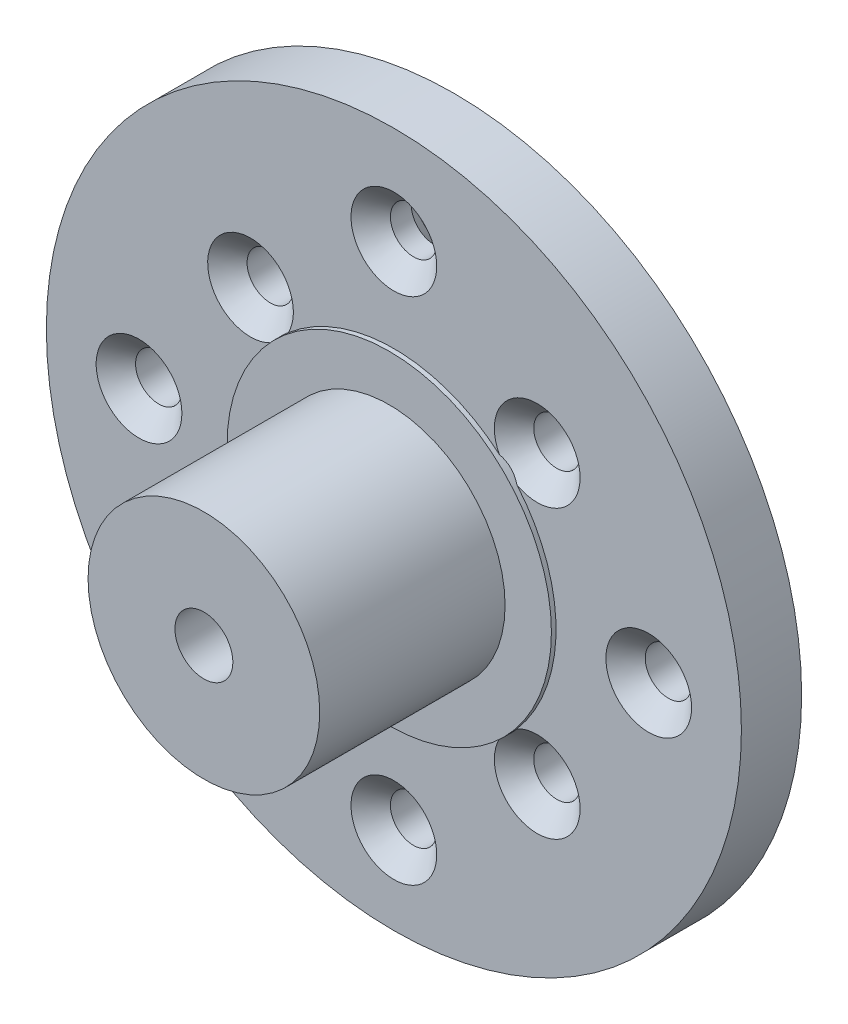
ISO-10303-21;
HEADER;
FILE_DESCRIPTION(('STEP AP214'),'2;1');
FILE_NAME('part.step','',(''),(''),'','','');
FILE_SCHEMA(('AUTOMOTIVE_DESIGN { 1 0 10303 214 1 1 1 1 }'));
ENDSEC;
DATA;
#1=APPLICATION_CONTEXT('core data for automotive mechanical design processes');
#2=APPLICATION_PROTOCOL_DEFINITION('international standard','automotive_design',2000,#1);
#3=PRODUCT_CONTEXT('',#1,'mechanical');
#4=PRODUCT('Part','Part','',(#3));
#5=PRODUCT_RELATED_PRODUCT_CATEGORY('part','',(#4));
#6=PRODUCT_DEFINITION_FORMATION('','',#4);
#7=PRODUCT_DEFINITION_CONTEXT('part definition',#1,'design');
#8=PRODUCT_DEFINITION('design','',#6,#7);
#9=PRODUCT_DEFINITION_SHAPE('','',#8);
#10=(LENGTH_UNIT() NAMED_UNIT(*) SI_UNIT(.MILLI.,.METRE.));
#11=(NAMED_UNIT(*) PLANE_ANGLE_UNIT() SI_UNIT($,.RADIAN.));
#12=(NAMED_UNIT(*) SI_UNIT($,.STERADIAN.) SOLID_ANGLE_UNIT());
#13=UNCERTAINTY_MEASURE_WITH_UNIT(LENGTH_MEASURE(1.E-05),#10,'distance_accuracy_value','');
#14=(GEOMETRIC_REPRESENTATION_CONTEXT(3) GLOBAL_UNCERTAINTY_ASSIGNED_CONTEXT((#13)) GLOBAL_UNIT_ASSIGNED_CONTEXT((#10,
#11,#12)) REPRESENTATION_CONTEXT('',''));
#15=CARTESIAN_POINT('',(0.,0.,0.));
#16=DIRECTION('',(0.,0.,1.));
#17=DIRECTION('',(1.,0.,0.));
#18=AXIS2_PLACEMENT_3D('',#15,#16,#17);
#19=CARTESIAN_POINT('',(6.5746019739521E-13,0.477974548121047,5.2));
#20=DIRECTION('',(0.,0.,1.));
#21=DIRECTION('',(1.,0.,0.));
#22=AXIS2_PLACEMENT_3D('',#19,#20,#21);
#23=PLANE('',#22);
#24=CARTESIAN_POINT('',(0.,22.,5.2));
#25=DIRECTION('',(0.,0.,1.));
#26=DIRECTION('',(1.,0.,0.));
#27=AXIS2_PLACEMENT_3D('',#24,#25,#26);
#28=CIRCLE('',#27,3.69999999999999);
#29=CARTESIAN_POINT('',(3.69999999999999,22.,5.2));
#30=VERTEX_POINT('',#29);
#31=EDGE_CURVE('E97',#30,#30,#28,.F.);
#32=ORIENTED_EDGE('',*,*,#31,.T.);
#33=EDGE_LOOP('',(#32));
#34=FACE_BOUND('',#33,.T.);
#35=CARTESIAN_POINT('',(22.0000000000003,1.01217741982465E-12,5.2));
#36=DIRECTION('',(0.,0.,1.));
#37=DIRECTION('',(1.,0.,0.));
#38=AXIS2_PLACEMENT_3D('',#35,#36,#37);
#39=CIRCLE('',#38,3.69999999999999);
#40=CARTESIAN_POINT('',(25.7000000000003,1.01217741982465E-12,5.2));
#41=VERTEX_POINT('',#40);
#42=EDGE_CURVE('E98',#41,#41,#39,.F.);
#43=ORIENTED_EDGE('',*,*,#42,.T.);
#44=EDGE_LOOP('',(#43));
#45=FACE_BOUND('',#44,.T.);
#46=CARTESIAN_POINT('',(1.31883586307563E-12,-21.9999999999993,5.2));
#47=DIRECTION('',(0.,0.,1.));
#48=DIRECTION('',(1.,0.,0.));
#49=AXIS2_PLACEMENT_3D('',#46,#47,#48);
#50=CIRCLE('',#49,3.69999999999999);
#51=CARTESIAN_POINT('',(3.70000000000131,-21.9999999999993,5.2));
#52=VERTEX_POINT('',#51);
#53=EDGE_CURVE('E134',#52,#52,#50,.F.);
#54=ORIENTED_EDGE('',*,*,#53,.T.);
#55=EDGE_LOOP('',(#54));
#56=FACE_BOUND('',#55,.T.);
#57=CARTESIAN_POINT('',(-21.999999999999,-3.10573911536192E-13,5.2));
#58=DIRECTION('',(0.,0.,1.));
#59=DIRECTION('',(1.,0.,0.));
#60=AXIS2_PLACEMENT_3D('',#57,#58,#59);
#61=CIRCLE('',#60,3.69999999999999);
#62=CARTESIAN_POINT('',(-18.299999999999,-3.10573911536192E-13,5.2));
#63=VERTEX_POINT('',#62);
#64=EDGE_CURVE('E123',#63,#63,#61,.F.);
#65=ORIENTED_EDGE('',*,*,#64,.T.);
#66=EDGE_LOOP('',(#65));
#67=FACE_BOUND('',#66,.T.);
#68=CARTESIAN_POINT('',(0.,0.,5.2));
#69=DIRECTION('',(0.,0.,1.));
#70=DIRECTION('',(1.,0.,0.));
#71=AXIS2_PLACEMENT_3D('',#68,#69,#70);
#72=CIRCLE('',#71,14.);
#73=CARTESIAN_POINT('',(9.11201370331922,10.6287913833381,5.2));
#74=VERTEX_POINT('',#73);
#75=CARTESIAN_POINT('',(-9.11201370331769,10.6287913833394,5.2));
#76=VERTEX_POINT('',#75);
#77=EDGE_CURVE('E96',#74,#76,#72,.T.);
#78=ORIENTED_EDGE('',*,*,#77,.F.);
#79=CARTESIAN_POINT('',(12.3743686707649,12.3743686707656,5.2));
#80=DIRECTION('',(0.,0.,1.));
#81=DIRECTION('',(1.,0.,0.));
#82=AXIS2_PLACEMENT_3D('',#79,#80,#81);
#83=CIRCLE('',#82,3.7);
#84=CARTESIAN_POINT('',(10.6287913833376,9.11201370331985,5.2));
#85=VERTEX_POINT('',#84);
#86=EDGE_CURVE('E87',#74,#85,#83,.F.);
#87=ORIENTED_EDGE('',*,*,#86,.T.);
#88=CARTESIAN_POINT('',(10.6287913833395,-9.11201370331766,5.2));
#89=VERTEX_POINT('',#88);
#90=EDGE_CURVE('E94',#89,#85,#72,.T.);
#91=ORIENTED_EDGE('',*,*,#90,.F.);
#92=CARTESIAN_POINT('',(12.3743686707659,-12.3743686707639,5.2));
#93=DIRECTION('',(0.,0.,1.));
#94=DIRECTION('',(1.,0.,0.));
#95=AXIS2_PLACEMENT_3D('',#92,#93,#94);
#96=CIRCLE('',#95,3.7);
#97=CARTESIAN_POINT('',(9.11201370331943,-10.6287913833379,5.2));
#98=VERTEX_POINT('',#97);
#99=EDGE_CURVE('E137',#89,#98,#96,.F.);
#100=ORIENTED_EDGE('',*,*,#99,.T.);
#101=CARTESIAN_POINT('',(-9.1120137033161,-10.6287913833408,5.2));
#102=VERTEX_POINT('',#101);
#103=EDGE_CURVE('E101',#102,#98,#72,.T.);
#104=ORIENTED_EDGE('',*,*,#103,.F.);
#105=CARTESIAN_POINT('',(-12.3743686707635,-12.3743686707649,5.2));
#106=DIRECTION('',(0.,0.,1.));
#107=DIRECTION('',(1.,0.,0.));
#108=AXIS2_PLACEMENT_3D('',#105,#106,#107);
#109=CIRCLE('',#108,3.69999999999999);
#110=CARTESIAN_POINT('',(-10.6287913833398,-9.11201370331727,5.2));
#111=VERTEX_POINT('',#110);
#112=EDGE_CURVE('E120',#102,#111,#109,.F.);
#113=ORIENTED_EDGE('',*,*,#112,.T.);
#114=CARTESIAN_POINT('',(-10.6287913833395,9.11201370331766,5.2));
#115=VERTEX_POINT('',#114);
#116=EDGE_CURVE('E104',#115,#111,#72,.T.);
#117=ORIENTED_EDGE('',*,*,#116,.F.);
#118=CARTESIAN_POINT('',(-12.3743686707646,12.3743686707646,5.2));
#119=DIRECTION('',(0.,0.,1.));
#120=DIRECTION('',(1.,0.,0.));
#121=AXIS2_PLACEMENT_3D('',#118,#119,#120);
#122=CIRCLE('',#121,3.69999999999999);
#123=EDGE_CURVE('E118',#115,#76,#122,.F.);
#124=ORIENTED_EDGE('',*,*,#123,.T.);
#125=EDGE_LOOP('',(#78,#87,#91,#100,#104,#113,#117,#124));
#126=FACE_BOUND('',#125,.T.);
#127=CARTESIAN_POINT('',(6.5746019739521E-13,0.477974548121047,5.2));
#128=DIRECTION('',(0.,0.,1.));
#129=DIRECTION('',(1.,0.,0.));
#130=AXIS2_PLACEMENT_3D('',#127,#128,#129);
#131=CIRCLE('',#130,30.);
#132=CARTESIAN_POINT('',(30.0000000000007,0.477974548121047,5.2));
#133=VERTEX_POINT('',#132);
#134=EDGE_CURVE('E269',#133,#133,#131,.T.);
#135=ORIENTED_EDGE('',*,*,#134,.T.);
#136=EDGE_LOOP('',(#135));
#137=FACE_BOUND('',#136,.T.);
#138=ADVANCED_FACE('F37',(#34,#45,#56,#67,#126,#137),#23,.T.);
#139=CARTESIAN_POINT('',(6.5746019739521E-13,0.477974548121047,0.));
#140=DIRECTION('',(0.,0.,1.));
#141=DIRECTION('',(1.,0.,0.));
#142=AXIS2_PLACEMENT_3D('',#139,#140,#141);
#143=PLANE('',#142);
#144=CARTESIAN_POINT('',(0.,22.,0.));
#145=DIRECTION('',(0.,0.,1.));
#146=DIRECTION('',(1.,0.,0.));
#147=AXIS2_PLACEMENT_3D('',#144,#145,#146);
#148=CIRCLE('',#147,3.69999999999999);
#149=CARTESIAN_POINT('',(3.69999999999999,22.,0.));
#150=VERTEX_POINT('',#149);
#151=EDGE_CURVE('E264',#150,#150,#148,.T.);
#152=ORIENTED_EDGE('',*,*,#151,.T.);
#153=EDGE_LOOP('',(#152));
#154=FACE_BOUND('',#153,.T.);
#155=CARTESIAN_POINT('',(6.5746019739521E-13,0.477974548121047,0.));
#156=DIRECTION('',(0.,0.,1.));
#157=DIRECTION('',(1.,0.,0.));
#158=AXIS2_PLACEMENT_3D('',#155,#156,#157);
#159=CIRCLE('',#158,30.);
#160=CARTESIAN_POINT('',(30.0000000000007,0.477974548121047,0.));
#161=VERTEX_POINT('',#160);
#162=EDGE_CURVE('E272',#161,#161,#159,.T.);
#163=ORIENTED_EDGE('',*,*,#162,.F.);
#164=EDGE_LOOP('',(#163));
#165=FACE_BOUND('',#164,.T.);
#166=CARTESIAN_POINT('',(-12.3743686707646,12.3743686707646,0.));
#167=DIRECTION('',(0.,0.,1.));
#168=DIRECTION('',(1.,0.,0.));
#169=AXIS2_PLACEMENT_3D('',#166,#167,#168);
#170=CIRCLE('',#169,2.);
#171=CARTESIAN_POINT('',(-10.3743686707646,12.3743686707646,0.));
#172=VERTEX_POINT('',#171);
#173=EDGE_CURVE('E275',#172,#172,#170,.T.);
#174=ORIENTED_EDGE('',*,*,#173,.T.);
#175=EDGE_LOOP('',(#174));
#176=FACE_BOUND('',#175,.T.);
#177=CARTESIAN_POINT('',(22.0000000000003,1.01217741982465E-12,0.));
#178=DIRECTION('',(0.,0.,1.));
#179=DIRECTION('',(1.,0.,0.));
#180=AXIS2_PLACEMENT_3D('',#177,#178,#179);
#181=CIRCLE('',#180,2.);
#182=CARTESIAN_POINT('',(24.0000000000003,1.01217741982465E-12,0.));
#183=VERTEX_POINT('',#182);
#184=EDGE_CURVE('E280',#183,#183,#181,.T.);
#185=ORIENTED_EDGE('',*,*,#184,.T.);
#186=EDGE_LOOP('',(#185));
#187=FACE_BOUND('',#186,.T.);
#188=CARTESIAN_POINT('',(12.3743686707649,12.3743686707656,0.));
#189=DIRECTION('',(0.,0.,1.));
#190=DIRECTION('',(1.,0.,0.));
#191=AXIS2_PLACEMENT_3D('',#188,#189,#190);
#192=CIRCLE('',#191,2.);
#193=CARTESIAN_POINT('',(14.3743686707649,12.3743686707656,0.));
#194=VERTEX_POINT('',#193);
#195=EDGE_CURVE('E283',#194,#194,#192,.T.);
#196=ORIENTED_EDGE('',*,*,#195,.T.);
#197=EDGE_LOOP('',(#196));
#198=FACE_BOUND('',#197,.T.);
#199=CARTESIAN_POINT('',(1.31883586307563E-12,-21.9999999999993,0.));
#200=DIRECTION('',(0.,0.,1.));
#201=DIRECTION('',(1.,0.,0.));
#202=AXIS2_PLACEMENT_3D('',#199,#200,#201);
#203=CIRCLE('',#202,2.);
#204=CARTESIAN_POINT('',(2.00000000000132,-21.9999999999993,0.));
#205=VERTEX_POINT('',#204);
#206=EDGE_CURVE('E286',#205,#205,#203,.T.);
#207=ORIENTED_EDGE('',*,*,#206,.T.);
#208=EDGE_LOOP('',(#207));
#209=FACE_BOUND('',#208,.T.);
#210=CARTESIAN_POINT('',(12.3743686707659,-12.3743686707639,0.));
#211=DIRECTION('',(0.,0.,1.));
#212=DIRECTION('',(1.,0.,0.));
#213=AXIS2_PLACEMENT_3D('',#210,#211,#212);
#214=CIRCLE('',#213,2.);
#215=CARTESIAN_POINT('',(14.3743686707659,-12.3743686707639,0.));
#216=VERTEX_POINT('',#215);
#217=EDGE_CURVE('E289',#216,#216,#214,.T.);
#218=ORIENTED_EDGE('',*,*,#217,.T.);
#219=EDGE_LOOP('',(#218));
#220=FACE_BOUND('',#219,.T.);
#221=CARTESIAN_POINT('',(-21.999999999999,-3.10573911536192E-13,0.));
#222=DIRECTION('',(0.,0.,1.));
#223=DIRECTION('',(1.,0.,0.));
#224=AXIS2_PLACEMENT_3D('',#221,#222,#223);
#225=CIRCLE('',#224,2.);
#226=CARTESIAN_POINT('',(-19.999999999999,-3.10573911536192E-13,0.));
#227=VERTEX_POINT('',#226);
#228=EDGE_CURVE('E292',#227,#227,#225,.T.);
#229=ORIENTED_EDGE('',*,*,#228,.T.);
#230=EDGE_LOOP('',(#229));
#231=FACE_BOUND('',#230,.T.);
#232=CARTESIAN_POINT('',(-12.3743686707635,-12.3743686707649,0.));
#233=DIRECTION('',(0.,0.,1.));
#234=DIRECTION('',(1.,0.,0.));
#235=AXIS2_PLACEMENT_3D('',#232,#233,#234);
#236=CIRCLE('',#235,2.);
#237=CARTESIAN_POINT('',(-10.3743686707635,-12.3743686707649,0.));
#238=VERTEX_POINT('',#237);
#239=EDGE_CURVE('E112',#238,#238,#236,.T.);
#240=ORIENTED_EDGE('',*,*,#239,.T.);
#241=EDGE_LOOP('',(#240));
#242=FACE_BOUND('',#241,.T.);
#243=ADVANCED_FACE('F229',(#154,#165,#176,#187,#198,#209,#220,#231,#242),#143,.F.);
#244=CARTESIAN_POINT('',(6.5746019739521E-13,0.477974548121047,5.2));
#245=DIRECTION('',(0.,0.,-1.));
#246=DIRECTION('',(-1.,0.,0.));
#247=AXIS2_PLACEMENT_3D('',#244,#245,#246);
#248=CYLINDRICAL_SURFACE('',#247,30.);
#249=ORIENTED_EDGE('',*,*,#134,.F.);
#250=EDGE_LOOP('',(#249));
#251=FACE_BOUND('',#250,.T.);
#252=ORIENTED_EDGE('',*,*,#162,.T.);
#253=EDGE_LOOP('',(#252));
#254=FACE_BOUND('',#253,.T.);
#255=ADVANCED_FACE('F235',(#251,#254),#248,.T.);
#256=CARTESIAN_POINT('',(0.,22.,5.2));
#257=DIRECTION('',(0.,0.,-1.));
#258=DIRECTION('',(-1.,0.,0.));
#259=AXIS2_PLACEMENT_3D('',#256,#257,#258);
#260=CYLINDRICAL_SURFACE('',#259,2.);
#261=CARTESIAN_POINT('',(0.,22.,1.7));
#262=DIRECTION('',(0.,0.,1.));
#263=DIRECTION('',(1.,0.,0.));
#264=AXIS2_PLACEMENT_3D('',#261,#262,#263);
#265=CIRCLE('',#264,2.);
#266=CARTESIAN_POINT('',(2.,22.,1.7));
#267=VERTEX_POINT('',#266);
#268=EDGE_CURVE('E124',#267,#267,#265,.F.);
#269=ORIENTED_EDGE('',*,*,#268,.T.);
#270=EDGE_LOOP('',(#269));
#271=FACE_BOUND('',#270,.T.);
#272=CARTESIAN_POINT('',(0.,22.,3.50000000000002));
#273=DIRECTION('',(0.,0.,1.));
#274=DIRECTION('',(1.,0.,0.));
#275=AXIS2_PLACEMENT_3D('',#272,#273,#274);
#276=CIRCLE('',#275,2.);
#277=CARTESIAN_POINT('',(2.,22.,3.50000000000002));
#278=VERTEX_POINT('',#277);
#279=EDGE_CURVE('E129',#278,#278,#276,.T.);
#280=ORIENTED_EDGE('',*,*,#279,.T.);
#281=EDGE_LOOP('',(#280));
#282=FACE_BOUND('',#281,.T.);
#283=ADVANCED_FACE('F240',(#271,#282),#260,.F.);
#284=CARTESIAN_POINT('',(-12.3743686707646,12.3743686707646,5.2));
#285=DIRECTION('',(0.,0.,-1.));
#286=DIRECTION('',(-1.,0.,0.));
#287=AXIS2_PLACEMENT_3D('',#284,#285,#286);
#288=CYLINDRICAL_SURFACE('',#287,2.);
#289=CARTESIAN_POINT('',(-12.3743686707646,12.3743686707646,3.50000000000002));
#290=DIRECTION('',(0.,0.,1.));
#291=DIRECTION('',(1.,0.,0.));
#292=AXIS2_PLACEMENT_3D('',#289,#290,#291);
#293=CIRCLE('',#292,2.);
#294=CARTESIAN_POINT('',(-10.3743686707646,12.3743686707646,3.50000000000002));
#295=VERTEX_POINT('',#294);
#296=EDGE_CURVE('E90',#295,#295,#293,.T.);
#297=ORIENTED_EDGE('',*,*,#296,.T.);
#298=EDGE_LOOP('',(#297));
#299=FACE_BOUND('',#298,.T.);
#300=ORIENTED_EDGE('',*,*,#173,.F.);
#301=EDGE_LOOP('',(#300));
#302=FACE_BOUND('',#301,.T.);
#303=ADVANCED_FACE('F325',(#299,#302),#288,.F.);
#304=CARTESIAN_POINT('',(22.0000000000003,1.01217741982465E-12,5.2));
#305=DIRECTION('',(0.,0.,-1.));
#306=DIRECTION('',(-1.,0.,0.));
#307=AXIS2_PLACEMENT_3D('',#304,#305,#306);
#308=CYLINDRICAL_SURFACE('',#307,2.);
#309=CARTESIAN_POINT('',(22.0000000000003,1.01217741982465E-12,3.50000000000002));
#310=DIRECTION('',(0.,0.,1.));
#311=DIRECTION('',(1.,0.,0.));
#312=AXIS2_PLACEMENT_3D('',#309,#310,#311);
#313=CIRCLE('',#312,2.);
#314=CARTESIAN_POINT('',(24.0000000000003,1.01217741982465E-12,3.50000000000002));
#315=VERTEX_POINT('',#314);
#316=EDGE_CURVE('E146',#315,#315,#313,.T.);
#317=ORIENTED_EDGE('',*,*,#316,.T.);
#318=EDGE_LOOP('',(#317));
#319=FACE_BOUND('',#318,.T.);
#320=ORIENTED_EDGE('',*,*,#184,.F.);
#321=EDGE_LOOP('',(#320));
#322=FACE_BOUND('',#321,.T.);
#323=ADVANCED_FACE('F322',(#319,#322),#308,.F.);
#324=CARTESIAN_POINT('',(12.3743686707649,12.3743686707656,5.2));
#325=DIRECTION('',(0.,0.,-1.));
#326=DIRECTION('',(-1.,0.,0.));
#327=AXIS2_PLACEMENT_3D('',#324,#325,#326);
#328=CYLINDRICAL_SURFACE('',#327,2.);
#329=CARTESIAN_POINT('',(12.3743686707649,12.3743686707656,3.50000000000002));
#330=DIRECTION('',(0.,0.,1.));
#331=DIRECTION('',(1.,0.,0.));
#332=AXIS2_PLACEMENT_3D('',#329,#330,#331);
#333=CIRCLE('',#332,2.);
#334=CARTESIAN_POINT('',(14.3743686707649,12.3743686707656,3.50000000000002));
#335=VERTEX_POINT('',#334);
#336=EDGE_CURVE('E143',#335,#335,#333,.T.);
#337=ORIENTED_EDGE('',*,*,#336,.T.);
#338=EDGE_LOOP('',(#337));
#339=FACE_BOUND('',#338,.T.);
#340=ORIENTED_EDGE('',*,*,#195,.F.);
#341=EDGE_LOOP('',(#340));
#342=FACE_BOUND('',#341,.T.);
#343=ADVANCED_FACE('F318',(#339,#342),#328,.F.);
#344=CARTESIAN_POINT('',(1.31883586307563E-12,-21.9999999999993,5.2));
#345=DIRECTION('',(0.,0.,-1.));
#346=DIRECTION('',(-1.,0.,0.));
#347=AXIS2_PLACEMENT_3D('',#344,#345,#346);
#348=CYLINDRICAL_SURFACE('',#347,2.);
#349=CARTESIAN_POINT('',(1.31883586307563E-12,-21.9999999999993,3.50000000000002));
#350=DIRECTION('',(0.,0.,1.));
#351=DIRECTION('',(1.,0.,0.));
#352=AXIS2_PLACEMENT_3D('',#349,#350,#351);
#353=CIRCLE('',#352,2.);
#354=CARTESIAN_POINT('',(2.00000000000132,-21.9999999999993,3.50000000000002));
#355=VERTEX_POINT('',#354);
#356=EDGE_CURVE('E152',#355,#355,#353,.T.);
#357=ORIENTED_EDGE('',*,*,#356,.T.);
#358=EDGE_LOOP('',(#357));
#359=FACE_BOUND('',#358,.T.);
#360=ORIENTED_EDGE('',*,*,#206,.F.);
#361=EDGE_LOOP('',(#360));
#362=FACE_BOUND('',#361,.T.);
#363=ADVANCED_FACE('F314',(#359,#362),#348,.F.);
#364=CARTESIAN_POINT('',(12.3743686707659,-12.3743686707639,5.2));
#365=DIRECTION('',(0.,0.,-1.));
#366=DIRECTION('',(-1.,0.,0.));
#367=AXIS2_PLACEMENT_3D('',#364,#365,#366);
#368=CYLINDRICAL_SURFACE('',#367,2.);
#369=CARTESIAN_POINT('',(12.3743686707659,-12.3743686707639,3.50000000000002));
#370=DIRECTION('',(0.,0.,1.));
#371=DIRECTION('',(1.,0.,0.));
#372=AXIS2_PLACEMENT_3D('',#369,#370,#371);
#373=CIRCLE('',#372,2.);
#374=CARTESIAN_POINT('',(14.3743686707659,-12.3743686707639,3.50000000000002));
#375=VERTEX_POINT('',#374);
#376=EDGE_CURVE('E149',#375,#375,#373,.T.);
#377=ORIENTED_EDGE('',*,*,#376,.T.);
#378=EDGE_LOOP('',(#377));
#379=FACE_BOUND('',#378,.T.);
#380=ORIENTED_EDGE('',*,*,#217,.F.);
#381=EDGE_LOOP('',(#380));
#382=FACE_BOUND('',#381,.T.);
#383=ADVANCED_FACE('F308',(#379,#382),#368,.F.);
#384=CARTESIAN_POINT('',(-21.999999999999,-3.10573911536192E-13,5.2));
#385=DIRECTION('',(0.,0.,-1.));
#386=DIRECTION('',(-1.,0.,0.));
#387=AXIS2_PLACEMENT_3D('',#384,#385,#386);
#388=CYLINDRICAL_SURFACE('',#387,2.);
#389=CARTESIAN_POINT('',(-21.999999999999,-3.10573911536192E-13,3.50000000000002));
#390=DIRECTION('',(0.,0.,1.));
#391=DIRECTION('',(1.,0.,0.));
#392=AXIS2_PLACEMENT_3D('',#389,#390,#391);
#393=CIRCLE('',#392,2.);
#394=CARTESIAN_POINT('',(-19.999999999999,-3.10573911536192E-13,3.50000000000002));
#395=VERTEX_POINT('',#394);
#396=EDGE_CURVE('E158',#395,#395,#393,.T.);
#397=ORIENTED_EDGE('',*,*,#396,.T.);
#398=EDGE_LOOP('',(#397));
#399=FACE_BOUND('',#398,.T.);
#400=ORIENTED_EDGE('',*,*,#228,.F.);
#401=EDGE_LOOP('',(#400));
#402=FACE_BOUND('',#401,.T.);
#403=ADVANCED_FACE('F300',(#399,#402),#388,.F.);
#404=CARTESIAN_POINT('',(-12.3743686707635,-12.3743686707649,5.2));
#405=DIRECTION('',(0.,0.,-1.));
#406=DIRECTION('',(-1.,0.,0.));
#407=AXIS2_PLACEMENT_3D('',#404,#405,#406);
#408=CYLINDRICAL_SURFACE('',#407,2.);
#409=CARTESIAN_POINT('',(-12.3743686707635,-12.3743686707649,3.50000000000002));
#410=DIRECTION('',(0.,0.,1.));
#411=DIRECTION('',(1.,0.,0.));
#412=AXIS2_PLACEMENT_3D('',#409,#410,#411);
#413=CIRCLE('',#412,2.);
#414=CARTESIAN_POINT('',(-10.3743686707635,-12.3743686707649,3.50000000000002));
#415=VERTEX_POINT('',#414);
#416=EDGE_CURVE('E155',#415,#415,#413,.T.);
#417=ORIENTED_EDGE('',*,*,#416,.T.);
#418=EDGE_LOOP('',(#417));
#419=FACE_BOUND('',#418,.T.);
#420=ORIENTED_EDGE('',*,*,#239,.F.);
#421=EDGE_LOOP('',(#420));
#422=FACE_BOUND('',#421,.T.);
#423=ADVANCED_FACE('F298',(#419,#422),#408,.F.);
#424=CARTESIAN_POINT('',(0.,0.,5.6));
#425=DIRECTION('',(0.,0.,-1.));
#426=DIRECTION('',(-1.,0.,0.));
#427=AXIS2_PLACEMENT_3D('',#424,#425,#426);
#428=CYLINDRICAL_SURFACE('',#427,14.);
#429=CARTESIAN_POINT('',(0.,0.,5.6));
#430=DIRECTION('',(0.,0.,1.));
#431=DIRECTION('',(1.,0.,0.));
#432=AXIS2_PLACEMENT_3D('',#429,#430,#431);
#433=CIRCLE('',#432,14.);
#434=CARTESIAN_POINT('',(14.,0.,5.6));
#435=VERTEX_POINT('',#434);
#436=EDGE_CURVE('E110',#435,#435,#433,.T.);
#437=ORIENTED_EDGE('',*,*,#436,.F.);
#438=EDGE_LOOP('',(#437));
#439=FACE_BOUND('',#438,.T.);
#440=ORIENTED_EDGE('',*,*,#90,.T.);
#441=CARTESIAN_POINT('',(10.6287913833376,9.11201370331985,5.2));
#442=CARTESIAN_POINT('',(10.5715511436639,9.1787900190233,5.16810022896963));
#443=CARTESIAN_POINT('',(10.5128783277521,9.24594831541777,5.13931356296274));
#444=CARTESIAN_POINT('',(10.3927629490636,9.38075731619698,5.08900988106635));
#445=CARTESIAN_POINT('',(10.3313149815951,9.44840874548555,5.06750781091913));
#446=CARTESIAN_POINT('',(10.2081441151322,9.58132141375564,5.03355246061901));
#447=CARTESIAN_POINT('',(10.1465039936962,9.64658451446418,5.02081233218784));
#448=CARTESIAN_POINT('',(10.0214649576941,9.77641804424159,5.00392182608091));
#449=CARTESIAN_POINT('',(9.95806796142283,9.84098912972321,4.99976242687143));
#450=CARTESIAN_POINT('',(9.83092241194386,9.96799523351706,5.000255286623));
#451=CARTESIAN_POINT('',(9.76719046254596,10.0304473768032,5.00478807164071));
#452=CARTESIAN_POINT('',(9.63908063107873,10.1536216445203,5.02217019355583));
#453=CARTESIAN_POINT('',(9.57470215937001,10.2143419498069,5.03502796187292));
#454=CARTESIAN_POINT('',(9.44363643780774,10.3356655053376,5.06897044808312));
#455=CARTESIAN_POINT('',(9.37694788477968,10.3961890091743,5.09032947457256));
#456=CARTESIAN_POINT('',(9.24405486293964,10.5145320822382,5.14012695368851));
#457=CARTESIAN_POINT('',(9.17784969446698,10.572356797422,5.16855121969355));
#458=CARTESIAN_POINT('',(9.11201370331921,10.6287913833381,5.2));
#459=B_SPLINE_CURVE_WITH_KNOTS('',3,(#441,#442,#443,#444,#445,#446,#447,#448,#449,#450,#451,
#452,#453,#454,#455,#456,#457,#458),.UNSPECIFIED.,.F.,.F.,(4,2,2,2,2,2,2,2,4),(0.,
0.280745045750357,0.56206265395697,0.833665214875819,1.10498207478377,1.37259640160191,
1.64048218910413,1.91782138811428,2.19460814096445),.UNSPECIFIED.);
#460=EDGE_CURVE('E83',#85,#74,#459,.T.);
#461=ORIENTED_EDGE('',*,*,#460,.T.);
#462=ORIENTED_EDGE('',*,*,#77,.T.);
#463=CARTESIAN_POINT('',(-9.11201370331769,10.6287913833394,5.2));
#464=CARTESIAN_POINT('',(-9.17879001902114,10.5715511436658,5.16810022896957));
#465=CARTESIAN_POINT('',(-9.2459483154156,10.512878327754,5.1393135629626));
#466=CARTESIAN_POINT('',(-9.38075731619481,10.3927629490656,5.08900988106607));
#467=CARTESIAN_POINT('',(-9.44840874548338,10.3313149815971,5.06750781091877));
#468=CARTESIAN_POINT('',(-9.58132141375347,10.2081441151343,5.0335524606185));
#469=CARTESIAN_POINT('',(-9.64658451446201,10.1465039936982,5.02081233218724));
#470=CARTESIAN_POINT('',(-9.77641804423942,10.0214649576962,5.00392182608015));
#471=CARTESIAN_POINT('',(-9.84098912972105,9.95806796142496,4.99976242687058));
#472=CARTESIAN_POINT('',(-9.96799523351521,9.83092241194574,5.00025528662198));
#473=CARTESIAN_POINT('',(-10.0304473768017,9.76719046254754,5.00478807163965));
#474=CARTESIAN_POINT('',(-10.1536216445193,9.63908063107971,5.02217019355477));
#475=CARTESIAN_POINT('',(-10.2143419498062,9.57470215937069,5.0350279618719));
#476=CARTESIAN_POINT('',(-10.3356655053376,9.44363643780779,5.06897044808227));
#477=CARTESIAN_POINT('',(-10.3961890091746,9.37694788477941,5.09032947457183));
#478=CARTESIAN_POINT('',(-10.5145320822391,9.24405486293872,5.1401269536881));
#479=CARTESIAN_POINT('',(-10.5723567974231,9.17784969446574,5.16855121969333));
#480=CARTESIAN_POINT('',(-10.6287913833395,9.11201370331766,5.2));
#481=B_SPLINE_CURVE_WITH_KNOTS('',3,(#463,#464,#465,#466,#467,#468,#469,#470,#471,#472,#473,
#474,#475,#476,#477,#478,#479,#480),.UNSPECIFIED.,.F.,.F.,(4,2,2,2,2,2,2,2,4),(0.,
0.280745045750358,0.562062653956973,0.833665214875803,1.10498207478373,1.37259640160314,
1.64048218910661,1.91782138811814,2.19460814096967),.UNSPECIFIED.);
#482=EDGE_CURVE('E11',#76,#115,#481,.T.);
#483=ORIENTED_EDGE('',*,*,#482,.T.);
#484=ORIENTED_EDGE('',*,*,#116,.T.);
#485=CARTESIAN_POINT('',(-10.6287913833398,-9.11201370331727,5.2));
#486=CARTESIAN_POINT('',(-10.5715511436661,-9.1787900190207,5.16810022896953));
#487=CARTESIAN_POINT('',(-10.5128783277544,-9.24594831541516,5.13931356296253));
#488=CARTESIAN_POINT('',(-10.392762949066,-9.38075731619436,5.08900988106591));
#489=CARTESIAN_POINT('',(-10.3313149815975,-9.44840874548293,5.06750781091857));
#490=CARTESIAN_POINT('',(-10.2081441151347,-9.58132141375301,5.03355246061822));
#491=CARTESIAN_POINT('',(-10.1465039936987,-9.64658451446154,5.02081233218692));
#492=CARTESIAN_POINT('',(-10.0214649576967,-9.77641804423895,5.00392182607974));
#493=CARTESIAN_POINT('',(-9.95806796142543,-9.84098912972057,4.99976242687012));
#494=CARTESIAN_POINT('',(-9.83092241194605,-9.9679952335149,5.00025528662143));
#495=CARTESIAN_POINT('',(-9.7671904625477,-10.0304473768015,5.00478807163908));
#496=CARTESIAN_POINT('',(-9.63908063107955,-10.1536216445195,5.0221701935542));
#497=CARTESIAN_POINT('',(-9.57470215937036,-10.2143419498066,5.03502796187136));
#498=CARTESIAN_POINT('',(-9.44363643780712,-10.3356655053382,5.06897044808181));
#499=CARTESIAN_POINT('',(-9.37694788477856,-10.3961890091753,5.09032947457144));
#500=CARTESIAN_POINT('',(-9.24405486293751,-10.5145320822401,5.14012695368788));
#501=CARTESIAN_POINT('',(-9.17784969446436,-10.5723567974243,5.16855121969321));
#502=CARTESIAN_POINT('',(-9.1120137033161,-10.6287913833408,5.2));
#503=B_SPLINE_CURVE_WITH_KNOTS('',3,(#485,#486,#487,#488,#489,#490,#491,#492,#493,#494,#495,
#496,#497,#498,#499,#500,#501,#502),.UNSPECIFIED.,.F.,.F.,(4,2,2,2,2,2,2,2,4),(0.,
0.280745045750356,0.562062653956974,0.833665214875796,1.10498207478371,1.37259640160378,
1.64048218910793,1.91782138812019,2.19460814097245),.UNSPECIFIED.);
#504=EDGE_CURVE('E52',#111,#102,#503,.T.);
#505=ORIENTED_EDGE('',*,*,#504,.T.);
#506=ORIENTED_EDGE('',*,*,#103,.T.);
#507=CARTESIAN_POINT('',(9.11201370331943,-10.6287913833379,5.2));
#508=CARTESIAN_POINT('',(9.17879001902287,-10.5715511436643,5.1681002289696));
#509=CARTESIAN_POINT('',(9.24594831541734,-10.5128783277525,5.13931356296266));
#510=CARTESIAN_POINT('',(9.38075731619653,-10.392762949064,5.0890098810662));
#511=CARTESIAN_POINT('',(9.4484087454851,-10.3313149815955,5.06750781091893));
#512=CARTESIAN_POINT('',(9.58132141375518,-10.2081441151326,5.03355246061873));
#513=CARTESIAN_POINT('',(9.64658451446372,-10.1465039936966,5.02081233218751));
#514=CARTESIAN_POINT('',(9.77641804424112,-10.0214649576946,5.0039218260805));
#515=CARTESIAN_POINT('',(9.84098912972274,-9.95806796142329,4.99976242687097));
#516=CARTESIAN_POINT('',(9.96799523351675,-9.83092241194418,5.00025528662246));
#517=CARTESIAN_POINT('',(10.0304473768031,-9.76719046254611,5.00478807164015));
#518=CARTESIAN_POINT('',(10.1536216445204,-9.63908063107855,5.02217019355526));
#519=CARTESIAN_POINT('',(10.2143419498072,-9.57470215936968,5.03502796187238));
#520=CARTESIAN_POINT('',(10.3356655053382,-9.44363643780706,5.06897044808266));
#521=CARTESIAN_POINT('',(10.3961890091751,-9.37694788477883,5.09032947457217));
#522=CARTESIAN_POINT('',(10.5145320822393,-9.24405486293842,5.14012695368829));
#523=CARTESIAN_POINT('',(10.5723567974232,-9.17784969446559,5.16855121969343));
#524=CARTESIAN_POINT('',(10.6287913833395,-9.11201370331766,5.2));
#525=B_SPLINE_CURVE_WITH_KNOTS('',3,(#507,#508,#509,#510,#511,#512,#513,#514,#515,#516,#517,
#518,#519,#520,#521,#522,#523,#524),.UNSPECIFIED.,.F.,.F.,(4,2,2,2,2,2,2,2,4),(0.,
0.280745045750358,0.562062653956971,0.833665214875811,1.10498207478375,1.37259640160256,
1.64048218910545,1.91782138811634,2.19460814096724),.UNSPECIFIED.);
#526=EDGE_CURVE('E59',#98,#89,#525,.T.);
#527=ORIENTED_EDGE('',*,*,#526,.T.);
#528=EDGE_LOOP('',(#440,#461,#462,#483,#484,#505,#506,#527));
#529=FACE_BOUND('',#528,.T.);
#530=ADVANCED_FACE('F100',(#439,#529),#428,.T.);
#531=CARTESIAN_POINT('',(0.,0.,5.6));
#532=DIRECTION('',(0.,0.,1.));
#533=DIRECTION('',(1.,0.,0.));
#534=AXIS2_PLACEMENT_3D('',#531,#532,#533);
#535=PLANE('',#534);
#536=CARTESIAN_POINT('',(0.,0.,5.6));
#537=DIRECTION('',(0.,0.,1.));
#538=DIRECTION('',(1.,0.,0.));
#539=AXIS2_PLACEMENT_3D('',#536,#537,#538);
#540=CIRCLE('',#539,10.);
#541=CARTESIAN_POINT('',(10.,0.,5.6));
#542=VERTEX_POINT('',#541);
#543=EDGE_CURVE('E265',#542,#542,#540,.T.);
#544=ORIENTED_EDGE('',*,*,#543,.F.);
#545=EDGE_LOOP('',(#544));
#546=FACE_BOUND('',#545,.T.);
#547=ORIENTED_EDGE('',*,*,#436,.T.);
#548=EDGE_LOOP('',(#547));
#549=FACE_BOUND('',#548,.T.);
#550=ADVANCED_FACE('F306',(#546,#549),#535,.T.);
#551=CARTESIAN_POINT('',(0.,0.,21.6));
#552=DIRECTION('',(0.,0.,-1.));
#553=DIRECTION('',(-1.,0.,0.));
#554=AXIS2_PLACEMENT_3D('',#551,#552,#553);
#555=CYLINDRICAL_SURFACE('',#554,10.);
#556=CARTESIAN_POINT('',(0.,0.,21.6));
#557=DIRECTION('',(0.,0.,1.));
#558=DIRECTION('',(1.,0.,0.));
#559=AXIS2_PLACEMENT_3D('',#556,#557,#558);
#560=CIRCLE('',#559,10.);
#561=CARTESIAN_POINT('',(10.,0.,21.6));
#562=VERTEX_POINT('',#561);
#563=EDGE_CURVE('E102',#562,#562,#560,.T.);
#564=ORIENTED_EDGE('',*,*,#563,.F.);
#565=EDGE_LOOP('',(#564));
#566=FACE_BOUND('',#565,.T.);
#567=ORIENTED_EDGE('',*,*,#543,.T.);
#568=EDGE_LOOP('',(#567));
#569=FACE_BOUND('',#568,.T.);
#570=ADVANCED_FACE('F396',(#566,#569),#555,.T.);
#571=CARTESIAN_POINT('',(0.,0.,21.6));
#572=DIRECTION('',(0.,0.,1.));
#573=DIRECTION('',(1.,0.,0.));
#574=AXIS2_PLACEMENT_3D('',#571,#572,#573);
#575=PLANE('',#574);
#576=CARTESIAN_POINT('',(0.,0.,21.6));
#577=DIRECTION('',(0.,0.,1.));
#578=DIRECTION('',(1.,0.,0.));
#579=AXIS2_PLACEMENT_3D('',#576,#577,#578);
#580=CIRCLE('',#579,2.5);
#581=CARTESIAN_POINT('',(2.5,0.,21.6));
#582=VERTEX_POINT('',#581);
#583=EDGE_CURVE('E522',#582,#582,#580,.T.);
#584=ORIENTED_EDGE('',*,*,#583,.F.);
#585=EDGE_LOOP('',(#584));
#586=FACE_BOUND('',#585,.T.);
#587=ORIENTED_EDGE('',*,*,#563,.T.);
#588=EDGE_LOOP('',(#587));
#589=FACE_BOUND('',#588,.T.);
#590=ADVANCED_FACE('F386',(#586,#589),#575,.T.);
#591=CARTESIAN_POINT('',(0.,0.,9.6));
#592=DIRECTION('',(0.,0.,1.));
#593=DIRECTION('',(1.,0.,0.));
#594=AXIS2_PLACEMENT_3D('',#591,#592,#593);
#595=CYLINDRICAL_SURFACE('',#594,2.5);
#596=CARTESIAN_POINT('',(0.,0.,9.6));
#597=DIRECTION('',(0.,0.,1.));
#598=DIRECTION('',(1.,0.,0.));
#599=AXIS2_PLACEMENT_3D('',#596,#597,#598);
#600=CIRCLE('',#599,2.5);
#601=CARTESIAN_POINT('',(2.5,0.,9.6));
#602=VERTEX_POINT('',#601);
#603=EDGE_CURVE('E106',#602,#602,#600,.T.);
#604=ORIENTED_EDGE('',*,*,#603,.F.);
#605=EDGE_LOOP('',(#604));
#606=FACE_BOUND('',#605,.T.);
#607=ORIENTED_EDGE('',*,*,#583,.T.);
#608=EDGE_LOOP('',(#607));
#609=FACE_BOUND('',#608,.T.);
#610=ADVANCED_FACE('F257',(#606,#609),#595,.F.);
#611=CARTESIAN_POINT('',(0.,0.,9.6));
#612=DIRECTION('',(0.,0.,1.));
#613=DIRECTION('',(1.,0.,0.));
#614=AXIS2_PLACEMENT_3D('',#611,#612,#613);
#615=PLANE('',#614);
#616=ORIENTED_EDGE('',*,*,#603,.T.);
#617=EDGE_LOOP('',(#616));
#618=FACE_BOUND('',#617,.T.);
#619=ADVANCED_FACE('F250',(#618),#615,.T.);
#620=CARTESIAN_POINT('',(0.,22.,0.));
#621=DIRECTION('',(0.,0.,-1.));
#622=DIRECTION('',(-1.,0.,0.));
#623=AXIS2_PLACEMENT_3D('',#620,#621,#622);
#624=CONICAL_SURFACE('',#623,3.69999999999999,0.785398163397446);
#625=ORIENTED_EDGE('',*,*,#268,.F.);
#626=EDGE_LOOP('',(#625));
#627=FACE_BOUND('',#626,.T.);
#628=ORIENTED_EDGE('',*,*,#151,.F.);
#629=EDGE_LOOP('',(#628));
#630=FACE_BOUND('',#629,.T.);
#631=ADVANCED_FACE('F246',(#627,#630),#624,.F.);
#632=CARTESIAN_POINT('',(0.,22.,3.50000000000002));
#633=DIRECTION('',(0.,0.,1.));
#634=DIRECTION('',(1.,0.,0.));
#635=AXIS2_PLACEMENT_3D('',#632,#633,#634);
#636=CONICAL_SURFACE('',#635,2.,0.785398163397452);
#637=ORIENTED_EDGE('',*,*,#31,.F.);
#638=EDGE_LOOP('',(#637));
#639=FACE_BOUND('',#638,.T.);
#640=ORIENTED_EDGE('',*,*,#279,.F.);
#641=EDGE_LOOP('',(#640));
#642=FACE_BOUND('',#641,.T.);
#643=ADVANCED_FACE('F186',(#639,#642),#636,.F.);
#644=CARTESIAN_POINT('',(12.3743686707649,12.3743686707656,3.50000000000002));
#645=DIRECTION('',(0.,0.,1.));
#646=DIRECTION('',(1.,0.,0.));
#647=AXIS2_PLACEMENT_3D('',#644,#645,#646);
#648=CONICAL_SURFACE('',#647,2.,0.785398163397452);
#649=ORIENTED_EDGE('',*,*,#460,.F.);
#650=ORIENTED_EDGE('',*,*,#86,.F.);
#651=EDGE_LOOP('',(#649,#650));
#652=FACE_BOUND('',#651,.T.);
#653=ORIENTED_EDGE('',*,*,#336,.F.);
#654=EDGE_LOOP('',(#653));
#655=FACE_BOUND('',#654,.T.);
#656=ADVANCED_FACE('F85',(#652,#655),#648,.F.);
#657=CARTESIAN_POINT('',(22.0000000000003,1.01217741982465E-12,3.50000000000002));
#658=DIRECTION('',(0.,0.,1.));
#659=DIRECTION('',(1.,0.,0.));
#660=AXIS2_PLACEMENT_3D('',#657,#658,#659);
#661=CONICAL_SURFACE('',#660,2.,0.785398163397452);
#662=ORIENTED_EDGE('',*,*,#42,.F.);
#663=EDGE_LOOP('',(#662));
#664=FACE_BOUND('',#663,.T.);
#665=ORIENTED_EDGE('',*,*,#316,.F.);
#666=EDGE_LOOP('',(#665));
#667=FACE_BOUND('',#666,.T.);
#668=ADVANCED_FACE('F185',(#664,#667),#661,.F.);
#669=CARTESIAN_POINT('',(12.3743686707659,-12.3743686707639,3.50000000000002));
#670=DIRECTION('',(0.,0.,1.));
#671=DIRECTION('',(1.,0.,0.));
#672=AXIS2_PLACEMENT_3D('',#669,#670,#671);
#673=CONICAL_SURFACE('',#672,2.,0.785398163397452);
#674=ORIENTED_EDGE('',*,*,#526,.F.);
#675=ORIENTED_EDGE('',*,*,#99,.F.);
#676=EDGE_LOOP('',(#674,#675));
#677=FACE_BOUND('',#676,.T.);
#678=ORIENTED_EDGE('',*,*,#376,.F.);
#679=EDGE_LOOP('',(#678));
#680=FACE_BOUND('',#679,.T.);
#681=ADVANCED_FACE('F192',(#677,#680),#673,.F.);
#682=CARTESIAN_POINT('',(1.31883586307563E-12,-21.9999999999993,3.50000000000002));
#683=DIRECTION('',(0.,0.,1.));
#684=DIRECTION('',(1.,0.,0.));
#685=AXIS2_PLACEMENT_3D('',#682,#683,#684);
#686=CONICAL_SURFACE('',#685,2.,0.785398163397452);
#687=ORIENTED_EDGE('',*,*,#53,.F.);
#688=EDGE_LOOP('',(#687));
#689=FACE_BOUND('',#688,.T.);
#690=ORIENTED_EDGE('',*,*,#356,.F.);
#691=EDGE_LOOP('',(#690));
#692=FACE_BOUND('',#691,.T.);
#693=ADVANCED_FACE('F200',(#689,#692),#686,.F.);
#694=CARTESIAN_POINT('',(-12.3743686707635,-12.3743686707649,3.50000000000002));
#695=DIRECTION('',(0.,0.,1.));
#696=DIRECTION('',(1.,0.,0.));
#697=AXIS2_PLACEMENT_3D('',#694,#695,#696);
#698=CONICAL_SURFACE('',#697,2.,0.785398163397452);
#699=ORIENTED_EDGE('',*,*,#504,.F.);
#700=ORIENTED_EDGE('',*,*,#112,.F.);
#701=EDGE_LOOP('',(#699,#700));
#702=FACE_BOUND('',#701,.T.);
#703=ORIENTED_EDGE('',*,*,#416,.F.);
#704=EDGE_LOOP('',(#703));
#705=FACE_BOUND('',#704,.T.);
#706=ADVANCED_FACE('F206',(#702,#705),#698,.F.);
#707=CARTESIAN_POINT('',(-21.999999999999,-3.10573911536192E-13,3.50000000000002));
#708=DIRECTION('',(0.,0.,1.));
#709=DIRECTION('',(1.,0.,0.));
#710=AXIS2_PLACEMENT_3D('',#707,#708,#709);
#711=CONICAL_SURFACE('',#710,2.,0.785398163397452);
#712=ORIENTED_EDGE('',*,*,#64,.F.);
#713=EDGE_LOOP('',(#712));
#714=FACE_BOUND('',#713,.T.);
#715=ORIENTED_EDGE('',*,*,#396,.F.);
#716=EDGE_LOOP('',(#715));
#717=FACE_BOUND('',#716,.T.);
#718=ADVANCED_FACE('F213',(#714,#717),#711,.F.);
#719=CARTESIAN_POINT('',(-12.3743686707646,12.3743686707646,3.50000000000002));
#720=DIRECTION('',(0.,0.,1.));
#721=DIRECTION('',(1.,0.,0.));
#722=AXIS2_PLACEMENT_3D('',#719,#720,#721);
#723=CONICAL_SURFACE('',#722,2.,0.785398163397452);
#724=ORIENTED_EDGE('',*,*,#482,.F.);
#725=ORIENTED_EDGE('',*,*,#123,.F.);
#726=EDGE_LOOP('',(#724,#725));
#727=FACE_BOUND('',#726,.T.);
#728=ORIENTED_EDGE('',*,*,#296,.F.);
#729=EDGE_LOOP('',(#728));
#730=FACE_BOUND('',#729,.T.);
#731=ADVANCED_FACE('F40',(#727,#730),#723,.F.);
#732=CLOSED_SHELL('',(#138,#243,#255,#283,#303,#323,#343,#363,#383,#403,#423,#530,#550,#570,
#590,#610,#619,#631,#643,#656,#668,#681,#693,#706,#718,#731));
#733=MANIFOLD_SOLID_BREP('B2',#732);
#734=ADVANCED_BREP_SHAPE_REPRESENTATION('',(#18,#733),#14);
#735=SHAPE_DEFINITION_REPRESENTATION(#9,#734);
ENDSEC;
END-ISO-10303-21;
